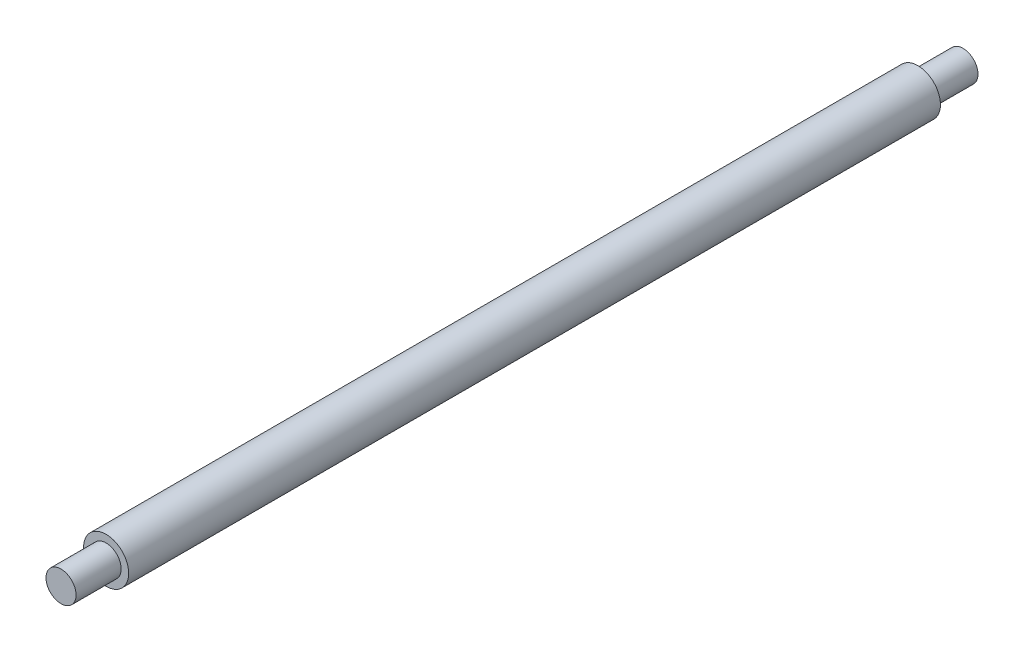
ISO-10303-21;
HEADER;
FILE_DESCRIPTION(('STEP AP214'),'2;1');
FILE_NAME('part.step','',(''),(''),'','','');
FILE_SCHEMA(('AUTOMOTIVE_DESIGN { 1 0 10303 214 1 1 1 1 }'));
ENDSEC;
DATA;
#1=APPLICATION_CONTEXT('core data for automotive mechanical design processes');
#2=APPLICATION_PROTOCOL_DEFINITION('international standard','automotive_design',2000,#1);
#3=PRODUCT_CONTEXT('',#1,'mechanical');
#4=PRODUCT('Part','Part','',(#3));
#5=PRODUCT_RELATED_PRODUCT_CATEGORY('part','',(#4));
#6=PRODUCT_DEFINITION_FORMATION('','',#4);
#7=PRODUCT_DEFINITION_CONTEXT('part definition',#1,'design');
#8=PRODUCT_DEFINITION('design','',#6,#7);
#9=PRODUCT_DEFINITION_SHAPE('','',#8);
#10=(LENGTH_UNIT() NAMED_UNIT(*) SI_UNIT(.MILLI.,.METRE.));
#11=(NAMED_UNIT(*) PLANE_ANGLE_UNIT() SI_UNIT($,.RADIAN.));
#12=(NAMED_UNIT(*) SI_UNIT($,.STERADIAN.) SOLID_ANGLE_UNIT());
#13=UNCERTAINTY_MEASURE_WITH_UNIT(LENGTH_MEASURE(1.E-05),#10,'distance_accuracy_value','');
#14=(GEOMETRIC_REPRESENTATION_CONTEXT(3) GLOBAL_UNCERTAINTY_ASSIGNED_CONTEXT((#13)) GLOBAL_UNIT_ASSIGNED_CONTEXT((#10,
#11,#12)) REPRESENTATION_CONTEXT('',''));
#15=CARTESIAN_POINT('',(0.,0.,0.));
#16=DIRECTION('',(0.,0.,1.));
#17=DIRECTION('',(1.,0.,0.));
#18=AXIS2_PLACEMENT_3D('',#15,#16,#17);
#19=CARTESIAN_POINT('',(0.,0.,342.9));
#20=DIRECTION('',(0.,0.,-1.));
#21=DIRECTION('',(-1.,0.,0.));
#22=AXIS2_PLACEMENT_3D('',#19,#20,#21);
#23=CYLINDRICAL_SURFACE('',#22,9.525);
#24=CARTESIAN_POINT('',(0.,0.,342.9));
#25=DIRECTION('',(0.,0.,1.));
#26=DIRECTION('',(1.,0.,0.));
#27=AXIS2_PLACEMENT_3D('',#24,#25,#26);
#28=CIRCLE('',#27,9.525);
#29=CARTESIAN_POINT('',(9.525,0.,342.9));
#30=VERTEX_POINT('',#29);
#31=EDGE_CURVE('E43',#30,#30,#28,.T.);
#32=ORIENTED_EDGE('',*,*,#31,.F.);
#33=EDGE_LOOP('',(#32));
#34=FACE_BOUND('',#33,.T.);
#35=CARTESIAN_POINT('',(0.,0.,0.));
#36=DIRECTION('',(0.,0.,1.));
#37=DIRECTION('',(1.,0.,0.));
#38=AXIS2_PLACEMENT_3D('',#35,#36,#37);
#39=CIRCLE('',#38,9.525);
#40=CARTESIAN_POINT('',(9.525,0.,0.));
#41=VERTEX_POINT('',#40);
#42=EDGE_CURVE('E34',#41,#41,#39,.T.);
#43=ORIENTED_EDGE('',*,*,#42,.T.);
#44=EDGE_LOOP('',(#43));
#45=FACE_BOUND('',#44,.T.);
#46=ADVANCED_FACE('F31',(#34,#45),#23,.T.);
#47=CARTESIAN_POINT('',(0.,0.,342.9));
#48=DIRECTION('',(0.,0.,1.));
#49=DIRECTION('',(1.,0.,0.));
#50=AXIS2_PLACEMENT_3D('',#47,#48,#49);
#51=PLANE('',#50);
#52=CARTESIAN_POINT('',(0.,0.,342.9));
#53=DIRECTION('',(0.,0.,1.));
#54=DIRECTION('',(1.,0.,0.));
#55=AXIS2_PLACEMENT_3D('',#52,#53,#54);
#56=CIRCLE('',#55,6.35);
#57=CARTESIAN_POINT('',(-6.35,0.,342.9));
#58=VERTEX_POINT('',#57);
#59=EDGE_CURVE('E38',#58,#58,#56,.T.);
#60=ORIENTED_EDGE('',*,*,#59,.F.);
#61=EDGE_LOOP('',(#60));
#62=FACE_BOUND('',#61,.T.);
#63=ORIENTED_EDGE('',*,*,#31,.T.);
#64=EDGE_LOOP('',(#63));
#65=FACE_BOUND('',#64,.T.);
#66=ADVANCED_FACE('F60',(#62,#65),#51,.T.);
#67=CARTESIAN_POINT('',(0.,0.,0.));
#68=DIRECTION('',(0.,0.,1.));
#69=DIRECTION('',(1.,0.,0.));
#70=AXIS2_PLACEMENT_3D('',#67,#68,#69);
#71=PLANE('',#70);
#72=CARTESIAN_POINT('',(0.,0.,0.));
#73=DIRECTION('',(0.,0.,-1.));
#74=DIRECTION('',(-1.,0.,0.));
#75=AXIS2_PLACEMENT_3D('',#72,#73,#74);
#76=CIRCLE('',#75,6.35);
#77=CARTESIAN_POINT('',(6.35,0.,0.));
#78=VERTEX_POINT('',#77);
#79=EDGE_CURVE('E10',#78,#78,#76,.T.);
#80=ORIENTED_EDGE('',*,*,#79,.F.);
#81=EDGE_LOOP('',(#80));
#82=FACE_BOUND('',#81,.T.);
#83=ORIENTED_EDGE('',*,*,#42,.F.);
#84=EDGE_LOOP('',(#83));
#85=FACE_BOUND('',#84,.T.);
#86=ADVANCED_FACE('F57',(#82,#85),#71,.F.);
#87=CARTESIAN_POINT('',(0.,0.,361.95));
#88=DIRECTION('',(0.,0.,-1.));
#89=DIRECTION('',(-1.,0.,0.));
#90=AXIS2_PLACEMENT_3D('',#87,#88,#89);
#91=CYLINDRICAL_SURFACE('',#90,6.35);
#92=CARTESIAN_POINT('',(0.,0.,361.95));
#93=DIRECTION('',(0.,0.,1.));
#94=DIRECTION('',(1.,0.,0.));
#95=AXIS2_PLACEMENT_3D('',#92,#93,#94);
#96=CIRCLE('',#95,6.35);
#97=CARTESIAN_POINT('',(-6.35,0.,361.95));
#98=VERTEX_POINT('',#97);
#99=EDGE_CURVE('E48',#98,#98,#96,.T.);
#100=CARTESIAN_POINT('',(-6.35,0.,361.95));
#101=CARTESIAN_POINT('',(-6.35,0.,361.7515625));
#102=CARTESIAN_POINT('',(-6.35,0.,361.553125));
#103=CARTESIAN_POINT('',(-6.35,0.,361.15625));
#104=CARTESIAN_POINT('',(-6.35,0.,360.9578125));
#105=CARTESIAN_POINT('',(-6.35,0.,360.5609375));
#106=CARTESIAN_POINT('',(-6.35,0.,360.3625));
#107=CARTESIAN_POINT('',(-6.35,0.,359.965625));
#108=CARTESIAN_POINT('',(-6.35,0.,359.7671875));
#109=CARTESIAN_POINT('',(-6.35,0.,359.3703125));
#110=CARTESIAN_POINT('',(-6.35,0.,359.171875));
#111=CARTESIAN_POINT('',(-6.35,0.,358.775));
#112=CARTESIAN_POINT('',(-6.35,0.,358.5765625));
#113=CARTESIAN_POINT('',(-6.35,0.,358.1796875));
#114=CARTESIAN_POINT('',(-6.35,0.,357.98125));
#115=CARTESIAN_POINT('',(-6.35,0.,357.584375));
#116=CARTESIAN_POINT('',(-6.35,0.,357.3859375));
#117=CARTESIAN_POINT('',(-6.35,0.,356.9890625));
#118=CARTESIAN_POINT('',(-6.35,0.,356.790625));
#119=CARTESIAN_POINT('',(-6.35,0.,356.39375));
#120=CARTESIAN_POINT('',(-6.35,0.,356.1953125));
#121=CARTESIAN_POINT('',(-6.35,0.,355.7984375));
#122=CARTESIAN_POINT('',(-6.35,0.,355.6));
#123=CARTESIAN_POINT('',(-6.35,0.,355.203125));
#124=CARTESIAN_POINT('',(-6.35,0.,355.0046875));
#125=CARTESIAN_POINT('',(-6.35,0.,354.6078125));
#126=CARTESIAN_POINT('',(-6.35,0.,354.409375));
#127=CARTESIAN_POINT('',(-6.35,0.,354.0125));
#128=CARTESIAN_POINT('',(-6.35,0.,353.8140625));
#129=CARTESIAN_POINT('',(-6.35,0.,353.4171875));
#130=CARTESIAN_POINT('',(-6.35,0.,353.21875));
#131=CARTESIAN_POINT('',(-6.35,0.,352.821875));
#132=CARTESIAN_POINT('',(-6.35,0.,352.6234375));
#133=CARTESIAN_POINT('',(-6.35,0.,352.2265625));
#134=CARTESIAN_POINT('',(-6.35,0.,352.028125));
#135=CARTESIAN_POINT('',(-6.35,0.,351.63125));
#136=CARTESIAN_POINT('',(-6.35,0.,351.4328125));
#137=CARTESIAN_POINT('',(-6.35,0.,351.0359375));
#138=CARTESIAN_POINT('',(-6.35,0.,350.8375));
#139=CARTESIAN_POINT('',(-6.35,0.,350.440625));
#140=CARTESIAN_POINT('',(-6.35,0.,350.2421875));
#141=CARTESIAN_POINT('',(-6.35,0.,349.8453125));
#142=CARTESIAN_POINT('',(-6.35,0.,349.646875));
#143=CARTESIAN_POINT('',(-6.35,0.,349.25));
#144=CARTESIAN_POINT('',(-6.35,0.,349.0515625));
#145=CARTESIAN_POINT('',(-6.35,0.,348.6546875));
#146=CARTESIAN_POINT('',(-6.35,0.,348.45625));
#147=CARTESIAN_POINT('',(-6.35,0.,348.059375));
#148=CARTESIAN_POINT('',(-6.35,0.,347.8609375));
#149=CARTESIAN_POINT('',(-6.35,0.,347.4640625));
#150=CARTESIAN_POINT('',(-6.35,0.,347.265625));
#151=CARTESIAN_POINT('',(-6.35,0.,346.86875));
#152=CARTESIAN_POINT('',(-6.35,0.,346.6703125));
#153=CARTESIAN_POINT('',(-6.35,0.,346.2734375));
#154=CARTESIAN_POINT('',(-6.35,0.,346.075));
#155=CARTESIAN_POINT('',(-6.35,0.,345.678125));
#156=CARTESIAN_POINT('',(-6.35,0.,345.4796875));
#157=CARTESIAN_POINT('',(-6.35,0.,345.0828125));
#158=CARTESIAN_POINT('',(-6.35,0.,344.884375));
#159=CARTESIAN_POINT('',(-6.35,0.,344.4875));
#160=CARTESIAN_POINT('',(-6.35,0.,344.2890625));
#161=CARTESIAN_POINT('',(-6.35,0.,343.8921875));
#162=CARTESIAN_POINT('',(-6.35,0.,343.69375));
#163=CARTESIAN_POINT('',(-6.35,0.,343.296875));
#164=CARTESIAN_POINT('',(-6.35,0.,343.0984375));
#165=CARTESIAN_POINT('',(-6.35,0.,342.9));
#166=B_SPLINE_CURVE_WITH_KNOTS('',3,(#100,#101,#102,#103,#104,#105,#106,#107,#108,#109,#110,
#111,#112,#113,#114,#115,#116,#117,#118,#119,#120,#121,#122,#123,#124,#125,#126,#127,#128,#129,
#130,#131,#132,#133,#134,#135,#136,#137,#138,#139,#140,#141,#142,#143,#144,#145,#146,#147,#148,
#149,#150,#151,#152,#153,#154,#155,#156,#157,#158,#159,#160,#161,#162,#163,#164,#165),
.UNSPECIFIED.,.F.,.F.,(4,2,2,2,2,2,2,2,2,2,2,2,2,2,2,2,2,2,2,2,2,2,2,2,2,2,2,2,2,2,2,2,4),(0.,
0.5953125,1.190625,1.7859375,2.38125,2.9765625,3.571875,4.1671875,4.7625,5.3578125,5.953125,
6.5484375,7.14375,7.7390625,8.334375,8.92968750000001,9.52500000000001,10.1203125,10.715625,
11.3109375,11.90625,12.5015625,13.096875,13.6921875,14.2875,14.8828125,15.478125,16.0734375,
16.66875,17.2640625,17.859375,18.4546875,19.05),.UNSPECIFIED.);
#167=EDGE_CURVE('BSEAM59',#98,#58,#166,.T.);
#168=ORIENTED_EDGE('',*,*,#99,.F.);
#169=ORIENTED_EDGE('',*,*,#59,.T.);
#170=ORIENTED_EDGE('',*,*,#167,.T.);
#171=ORIENTED_EDGE('',*,*,#167,.F.);
#172=EDGE_LOOP('',(#168,#170,#169,#171));
#173=FACE_BOUND('',#172,.T.);
#174=ADVANCED_FACE('F59',(#173),#91,.T.);
#175=CARTESIAN_POINT('',(0.,0.,361.95));
#176=DIRECTION('',(0.,0.,1.));
#177=DIRECTION('',(1.,0.,0.));
#178=AXIS2_PLACEMENT_3D('',#175,#176,#177);
#179=PLANE('',#178);
#180=ORIENTED_EDGE('',*,*,#99,.T.);
#181=EDGE_LOOP('',(#180));
#182=FACE_BOUND('',#181,.T.);
#183=ADVANCED_FACE('F66',(#182),#179,.T.);
#184=CARTESIAN_POINT('',(0.,0.,-19.05));
#185=DIRECTION('',(0.,0.,1.));
#186=DIRECTION('',(1.,0.,0.));
#187=AXIS2_PLACEMENT_3D('',#184,#185,#186);
#188=CYLINDRICAL_SURFACE('',#187,6.35);
#189=CARTESIAN_POINT('',(0.,0.,-19.05));
#190=DIRECTION('',(0.,0.,-1.));
#191=DIRECTION('',(-1.,0.,0.));
#192=AXIS2_PLACEMENT_3D('',#189,#190,#191);
#193=CIRCLE('',#192,6.35);
#194=CARTESIAN_POINT('',(6.35,0.,-19.05));
#195=VERTEX_POINT('',#194);
#196=EDGE_CURVE('E47',#195,#195,#193,.T.);
#197=CARTESIAN_POINT('',(6.35,0.,-19.05));
#198=CARTESIAN_POINT('',(6.35,0.,-18.8515625));
#199=CARTESIAN_POINT('',(6.35,0.,-18.653125));
#200=CARTESIAN_POINT('',(6.35,0.,-18.25625));
#201=CARTESIAN_POINT('',(6.35,0.,-18.0578125));
#202=CARTESIAN_POINT('',(6.35,0.,-17.6609375));
#203=CARTESIAN_POINT('',(6.35,0.,-17.4625));
#204=CARTESIAN_POINT('',(6.35,0.,-17.065625));
#205=CARTESIAN_POINT('',(6.35,0.,-16.8671875));
#206=CARTESIAN_POINT('',(6.35,0.,-16.4703125));
#207=CARTESIAN_POINT('',(6.35,0.,-16.271875));
#208=CARTESIAN_POINT('',(6.35,0.,-15.875));
#209=CARTESIAN_POINT('',(6.35,0.,-15.6765625));
#210=CARTESIAN_POINT('',(6.35,0.,-15.2796875));
#211=CARTESIAN_POINT('',(6.35,0.,-15.08125));
#212=CARTESIAN_POINT('',(6.35,0.,-14.684375));
#213=CARTESIAN_POINT('',(6.35,0.,-14.4859375));
#214=CARTESIAN_POINT('',(6.35,0.,-14.0890625));
#215=CARTESIAN_POINT('',(6.35,0.,-13.890625));
#216=CARTESIAN_POINT('',(6.35,0.,-13.49375));
#217=CARTESIAN_POINT('',(6.35,0.,-13.2953125));
#218=CARTESIAN_POINT('',(6.35,0.,-12.8984375));
#219=CARTESIAN_POINT('',(6.35,0.,-12.7));
#220=CARTESIAN_POINT('',(6.35,0.,-12.303125));
#221=CARTESIAN_POINT('',(6.35,0.,-12.1046875));
#222=CARTESIAN_POINT('',(6.35,0.,-11.7078125));
#223=CARTESIAN_POINT('',(6.35,0.,-11.509375));
#224=CARTESIAN_POINT('',(6.35,0.,-11.1125));
#225=CARTESIAN_POINT('',(6.35,0.,-10.9140625));
#226=CARTESIAN_POINT('',(6.35,0.,-10.5171875));
#227=CARTESIAN_POINT('',(6.35,0.,-10.31875));
#228=CARTESIAN_POINT('',(6.35,0.,-9.921875));
#229=CARTESIAN_POINT('',(6.35,0.,-9.7234375));
#230=CARTESIAN_POINT('',(6.35,0.,-9.3265625));
#231=CARTESIAN_POINT('',(6.35,0.,-9.128125));
#232=CARTESIAN_POINT('',(6.35,0.,-8.73125));
#233=CARTESIAN_POINT('',(6.35,0.,-8.5328125));
#234=CARTESIAN_POINT('',(6.35,0.,-8.1359375));
#235=CARTESIAN_POINT('',(6.35,0.,-7.9375));
#236=CARTESIAN_POINT('',(6.35,0.,-7.540625));
#237=CARTESIAN_POINT('',(6.35,0.,-7.3421875));
#238=CARTESIAN_POINT('',(6.35,0.,-6.9453125));
#239=CARTESIAN_POINT('',(6.35,0.,-6.746875));
#240=CARTESIAN_POINT('',(6.35,0.,-6.35));
#241=CARTESIAN_POINT('',(6.35,0.,-6.1515625));
#242=CARTESIAN_POINT('',(6.35,0.,-5.7546875));
#243=CARTESIAN_POINT('',(6.35,0.,-5.55625));
#244=CARTESIAN_POINT('',(6.35,0.,-5.159375));
#245=CARTESIAN_POINT('',(6.35,0.,-4.9609375));
#246=CARTESIAN_POINT('',(6.35,0.,-4.5640625));
#247=CARTESIAN_POINT('',(6.35,0.,-4.365625));
#248=CARTESIAN_POINT('',(6.35,0.,-3.96875));
#249=CARTESIAN_POINT('',(6.35,0.,-3.7703125));
#250=CARTESIAN_POINT('',(6.35,0.,-3.3734375));
#251=CARTESIAN_POINT('',(6.35,0.,-3.175));
#252=CARTESIAN_POINT('',(6.35,0.,-2.778125));
#253=CARTESIAN_POINT('',(6.35,0.,-2.5796875));
#254=CARTESIAN_POINT('',(6.35,0.,-2.1828125));
#255=CARTESIAN_POINT('',(6.35,0.,-1.984375));
#256=CARTESIAN_POINT('',(6.35,0.,-1.5875));
#257=CARTESIAN_POINT('',(6.35,0.,-1.3890625));
#258=CARTESIAN_POINT('',(6.35,0.,-0.992187500000001));
#259=CARTESIAN_POINT('',(6.35,0.,-0.793750000000001));
#260=CARTESIAN_POINT('',(6.35,0.,-0.396875));
#261=CARTESIAN_POINT('',(6.35,0.,-0.1984375));
#262=CARTESIAN_POINT('',(6.35,0.,0.));
#263=B_SPLINE_CURVE_WITH_KNOTS('',3,(#197,#198,#199,#200,#201,#202,#203,#204,#205,#206,#207,
#208,#209,#210,#211,#212,#213,#214,#215,#216,#217,#218,#219,#220,#221,#222,#223,#224,#225,#226,
#227,#228,#229,#230,#231,#232,#233,#234,#235,#236,#237,#238,#239,#240,#241,#242,#243,#244,#245,
#246,#247,#248,#249,#250,#251,#252,#253,#254,#255,#256,#257,#258,#259,#260,#261,#262),
.UNSPECIFIED.,.F.,.F.,(4,2,2,2,2,2,2,2,2,2,2,2,2,2,2,2,2,2,2,2,2,2,2,2,2,2,2,2,2,2,2,2,4),(0.,
0.5953125,1.190625,1.7859375,2.38125,2.9765625,3.571875,4.1671875,4.7625,5.3578125,5.953125,
6.5484375,7.14375,7.7390625,8.334375,8.9296875,9.525,10.1203125,10.715625,11.3109375,11.90625,
12.5015625,13.096875,13.6921875,14.2875,14.8828125,15.478125,16.0734375,16.66875,17.2640625,
17.859375,18.4546875,19.05),.UNSPECIFIED.);
#264=EDGE_CURVE('BSEAM94',#195,#78,#263,.T.);
#265=ORIENTED_EDGE('',*,*,#196,.F.);
#266=ORIENTED_EDGE('',*,*,#79,.T.);
#267=ORIENTED_EDGE('',*,*,#264,.T.);
#268=ORIENTED_EDGE('',*,*,#264,.F.);
#269=EDGE_LOOP('',(#265,#267,#266,#268));
#270=FACE_BOUND('',#269,.T.);
#271=ADVANCED_FACE('F94',(#270),#188,.T.);
#272=CARTESIAN_POINT('',(0.,0.,-19.05));
#273=DIRECTION('',(0.,0.,-1.));
#274=DIRECTION('',(-1.,0.,0.));
#275=AXIS2_PLACEMENT_3D('',#272,#273,#274);
#276=PLANE('',#275);
#277=ORIENTED_EDGE('',*,*,#196,.T.);
#278=EDGE_LOOP('',(#277));
#279=FACE_BOUND('',#278,.T.);
#280=ADVANCED_FACE('F108',(#279),#276,.T.);
#281=CLOSED_SHELL('',(#46,#66,#86,#174,#183,#271,#280));
#282=MANIFOLD_SOLID_BREP('B2',#281);
#283=ADVANCED_BREP_SHAPE_REPRESENTATION('',(#18,#282),#14);
#284=SHAPE_DEFINITION_REPRESENTATION(#9,#283);
ENDSEC;
END-ISO-10303-21;
